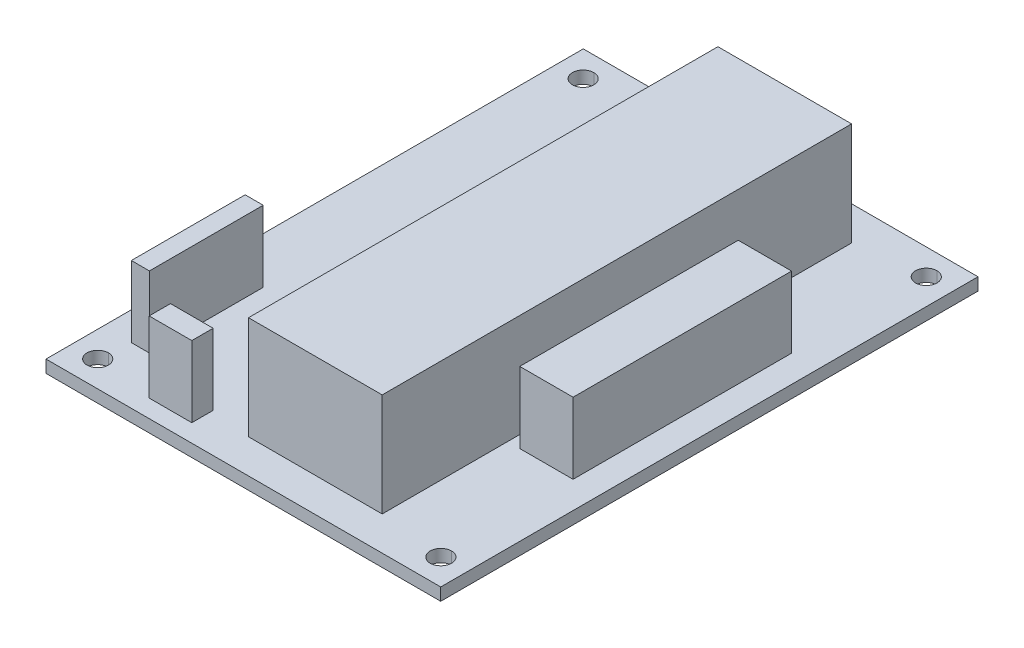
ISO-10303-21;
HEADER;
FILE_DESCRIPTION(('STEP AP214'),'2;1');
FILE_NAME('part.step','',(''),(''),'','','');
FILE_SCHEMA(('AUTOMOTIVE_DESIGN { 1 0 10303 214 1 1 1 1 }'));
ENDSEC;
DATA;
#1=APPLICATION_CONTEXT('core data for automotive mechanical design processes');
#2=APPLICATION_PROTOCOL_DEFINITION('international standard','automotive_design',2000,#1);
#3=PRODUCT_CONTEXT('',#1,'mechanical');
#4=PRODUCT('Part','Part','',(#3));
#5=PRODUCT_RELATED_PRODUCT_CATEGORY('part','',(#4));
#6=PRODUCT_DEFINITION_FORMATION('','',#4);
#7=PRODUCT_DEFINITION_CONTEXT('part definition',#1,'design');
#8=PRODUCT_DEFINITION('design','',#6,#7);
#9=PRODUCT_DEFINITION_SHAPE('','',#8);
#10=(LENGTH_UNIT() NAMED_UNIT(*) SI_UNIT(.MILLI.,.METRE.));
#11=(NAMED_UNIT(*) PLANE_ANGLE_UNIT() SI_UNIT($,.RADIAN.));
#12=(NAMED_UNIT(*) SI_UNIT($,.STERADIAN.) SOLID_ANGLE_UNIT());
#13=UNCERTAINTY_MEASURE_WITH_UNIT(LENGTH_MEASURE(1.E-05),#10,'distance_accuracy_value','');
#14=(GEOMETRIC_REPRESENTATION_CONTEXT(3) GLOBAL_UNCERTAINTY_ASSIGNED_CONTEXT((#13)) GLOBAL_UNIT_ASSIGNED_CONTEXT((#10,
#11,#12)) REPRESENTATION_CONTEXT('',''));
#15=CARTESIAN_POINT('',(0.,0.,0.));
#16=DIRECTION('',(0.,0.,1.));
#17=DIRECTION('',(1.,0.,0.));
#18=AXIS2_PLACEMENT_3D('',#15,#16,#17);
#19=CARTESIAN_POINT('',(0.,11.75,0.));
#20=DIRECTION('',(0.,1.,0.));
#21=DIRECTION('',(1.,0.,0.));
#22=AXIS2_PLACEMENT_3D('',#19,#20,#21);
#23=PLANE('',#22);
#24=DIRECTION('',(0.,0.,-1.));
#25=VECTOR('',#24,1.);
#26=CARTESIAN_POINT('',(-9.75,11.75,32.27));
#27=LINE('',#26,#25);
#28=CARTESIAN_POINT('',(-9.75,11.75,35.27));
#29=VERTEX_POINT('',#28);
#30=CARTESIAN_POINT('',(-9.75,11.75,32.27));
#31=VERTEX_POINT('',#30);
#32=EDGE_CURVE('E393',#29,#31,#27,.T.);
#33=ORIENTED_EDGE('',*,*,#32,.T.);
#34=DIRECTION('',(-1.,0.,0.));
#35=VECTOR('',#34,1.);
#36=CARTESIAN_POINT('',(-15.75,11.75,32.27));
#37=LINE('',#36,#35);
#38=CARTESIAN_POINT('',(-15.75,11.75,32.27));
#39=VERTEX_POINT('',#38);
#40=EDGE_CURVE('E315',#31,#39,#37,.T.);
#41=ORIENTED_EDGE('',*,*,#40,.T.);
#42=DIRECTION('',(0.,0.,1.));
#43=VECTOR('',#42,1.);
#44=CARTESIAN_POINT('',(-15.75,11.75,32.27));
#45=LINE('',#44,#43);
#46=CARTESIAN_POINT('',(-15.75,11.75,35.27));
#47=VERTEX_POINT('',#46);
#48=EDGE_CURVE('E28',#39,#47,#45,.T.);
#49=ORIENTED_EDGE('',*,*,#48,.T.);
#50=DIRECTION('',(1.,0.,0.));
#51=VECTOR('',#50,1.);
#52=CARTESIAN_POINT('',(-15.75,11.75,35.27));
#53=LINE('',#52,#51);
#54=EDGE_CURVE('E11',#47,#29,#53,.T.);
#55=ORIENTED_EDGE('',*,*,#54,.T.);
#56=EDGE_LOOP('',(#33,#41,#49,#55));
#57=FACE_BOUND('',#56,.T.);
#58=ADVANCED_FACE('F17',(#57),#23,.T.);
#59=CARTESIAN_POINT('',(-15.75,11.75,35.27));
#60=DIRECTION('',(0.,0.,-1.));
#61=DIRECTION('',(0.,-1.,0.));
#62=AXIS2_PLACEMENT_3D('',#59,#60,#61);
#63=PLANE('',#62);
#64=DIRECTION('',(1.,0.,0.));
#65=VECTOR('',#64,1.);
#66=CARTESIAN_POINT('',(-15.75,1.75,35.27));
#67=LINE('',#66,#65);
#68=CARTESIAN_POINT('',(-15.75,1.75,35.27));
#69=VERTEX_POINT('',#68);
#70=CARTESIAN_POINT('',(-9.75,1.75,35.27));
#71=VERTEX_POINT('',#70);
#72=EDGE_CURVE('E373',#69,#71,#67,.T.);
#73=ORIENTED_EDGE('',*,*,#72,.T.);
#74=DIRECTION('',(0.,-1.,0.));
#75=VECTOR('',#74,1.);
#76=CARTESIAN_POINT('',(-9.75,11.75,35.27));
#77=LINE('',#76,#75);
#78=EDGE_CURVE('E389',#29,#71,#77,.T.);
#79=ORIENTED_EDGE('',*,*,#78,.F.);
#80=ORIENTED_EDGE('',*,*,#54,.F.);
#81=DIRECTION('',(0.,-1.,0.));
#82=VECTOR('',#81,1.);
#83=CARTESIAN_POINT('',(-15.75,11.75,35.27));
#84=LINE('',#83,#82);
#85=EDGE_CURVE('E313',#47,#69,#84,.T.);
#86=ORIENTED_EDGE('',*,*,#85,.T.);
#87=EDGE_LOOP('',(#73,#79,#80,#86));
#88=FACE_BOUND('',#87,.T.);
#89=ADVANCED_FACE('F671',(#88),#63,.F.);
#90=CARTESIAN_POINT('',(-15.75,11.75,32.27));
#91=DIRECTION('',(1.,0.,0.));
#92=DIRECTION('',(0.,1.,0.));
#93=AXIS2_PLACEMENT_3D('',#90,#91,#92);
#94=PLANE('',#93);
#95=DIRECTION('',(0.,0.,1.));
#96=VECTOR('',#95,1.);
#97=CARTESIAN_POINT('',(-15.75,1.75,32.27));
#98=LINE('',#97,#96);
#99=CARTESIAN_POINT('',(-15.75,1.75,32.27));
#100=VERTEX_POINT('',#99);
#101=EDGE_CURVE('E370',#100,#69,#98,.T.);
#102=ORIENTED_EDGE('',*,*,#101,.T.);
#103=ORIENTED_EDGE('',*,*,#85,.F.);
#104=ORIENTED_EDGE('',*,*,#48,.F.);
#105=DIRECTION('',(0.,-1.,0.));
#106=VECTOR('',#105,1.);
#107=CARTESIAN_POINT('',(-15.75,11.75,32.27));
#108=LINE('',#107,#106);
#109=EDGE_CURVE('E392',#39,#100,#108,.T.);
#110=ORIENTED_EDGE('',*,*,#109,.T.);
#111=EDGE_LOOP('',(#102,#103,#104,#110));
#112=FACE_BOUND('',#111,.T.);
#113=ADVANCED_FACE('F677',(#112),#94,.F.);
#114=CARTESIAN_POINT('',(-15.75,11.75,32.27));
#115=DIRECTION('',(0.,0.,1.));
#116=DIRECTION('',(1.,0.,0.));
#117=AXIS2_PLACEMENT_3D('',#114,#115,#116);
#118=PLANE('',#117);
#119=DIRECTION('',(-1.,0.,0.));
#120=VECTOR('',#119,1.);
#121=CARTESIAN_POINT('',(-15.75,1.75,32.27));
#122=LINE('',#121,#120);
#123=CARTESIAN_POINT('',(-9.75,1.75,32.27));
#124=VERTEX_POINT('',#123);
#125=EDGE_CURVE('E359',#124,#100,#122,.T.);
#126=ORIENTED_EDGE('',*,*,#125,.T.);
#127=ORIENTED_EDGE('',*,*,#109,.F.);
#128=ORIENTED_EDGE('',*,*,#40,.F.);
#129=DIRECTION('',(0.,-1.,0.));
#130=VECTOR('',#129,1.);
#131=CARTESIAN_POINT('',(-9.75,11.75,32.27));
#132=LINE('',#131,#130);
#133=EDGE_CURVE('E503',#31,#124,#132,.T.);
#134=ORIENTED_EDGE('',*,*,#133,.T.);
#135=EDGE_LOOP('',(#126,#127,#128,#134));
#136=FACE_BOUND('',#135,.T.);
#137=ADVANCED_FACE('F711',(#136),#118,.F.);
#138=CARTESIAN_POINT('',(-9.75,11.75,32.27));
#139=DIRECTION('',(-1.,0.,0.));
#140=DIRECTION('',(0.,0.,1.));
#141=AXIS2_PLACEMENT_3D('',#138,#139,#140);
#142=PLANE('',#141);
#143=DIRECTION('',(0.,0.,-1.));
#144=VECTOR('',#143,1.);
#145=CARTESIAN_POINT('',(-9.75,1.75,32.27));
#146=LINE('',#145,#144);
#147=EDGE_CURVE('E511',#71,#124,#146,.T.);
#148=ORIENTED_EDGE('',*,*,#147,.T.);
#149=ORIENTED_EDGE('',*,*,#133,.F.);
#150=ORIENTED_EDGE('',*,*,#32,.F.);
#151=ORIENTED_EDGE('',*,*,#78,.T.);
#152=EDGE_LOOP('',(#148,#149,#150,#151));
#153=FACE_BOUND('',#152,.T.);
#154=ADVANCED_FACE('F707',(#153),#142,.F.);
#155=CARTESIAN_POINT('',(0.,11.75,0.));
#156=DIRECTION('',(0.,1.,0.));
#157=DIRECTION('',(1.,0.,0.));
#158=AXIS2_PLACEMENT_3D('',#155,#156,#157);
#159=PLANE('',#158);
#160=DIRECTION('',(0.,0.,-1.));
#161=VECTOR('',#160,1.);
#162=CARTESIAN_POINT('',(-21.21,11.75,13.77));
#163=LINE('',#162,#161);
#164=CARTESIAN_POINT('',(-21.21,11.75,29.77));
#165=VERTEX_POINT('',#164);
#166=CARTESIAN_POINT('',(-21.21,11.75,13.77));
#167=VERTEX_POINT('',#166);
#168=EDGE_CURVE('E443',#165,#167,#163,.T.);
#169=ORIENTED_EDGE('',*,*,#168,.T.);
#170=DIRECTION('',(-1.,0.,0.));
#171=VECTOR('',#170,1.);
#172=CARTESIAN_POINT('',(-23.75,11.75,13.77));
#173=LINE('',#172,#171);
#174=CARTESIAN_POINT('',(-23.75,11.75,13.77));
#175=VERTEX_POINT('',#174);
#176=EDGE_CURVE('E422',#167,#175,#173,.T.);
#177=ORIENTED_EDGE('',*,*,#176,.T.);
#178=DIRECTION('',(0.,0.,1.));
#179=VECTOR('',#178,1.);
#180=CARTESIAN_POINT('',(-23.75,11.75,13.77));
#181=LINE('',#180,#179);
#182=CARTESIAN_POINT('',(-23.75,11.75,29.77));
#183=VERTEX_POINT('',#182);
#184=EDGE_CURVE('E360',#175,#183,#181,.T.);
#185=ORIENTED_EDGE('',*,*,#184,.T.);
#186=DIRECTION('',(1.,0.,0.));
#187=VECTOR('',#186,1.);
#188=CARTESIAN_POINT('',(-23.75,11.75,29.77));
#189=LINE('',#188,#187);
#190=EDGE_CURVE('E364',#183,#165,#189,.T.);
#191=ORIENTED_EDGE('',*,*,#190,.T.);
#192=EDGE_LOOP('',(#169,#177,#185,#191));
#193=FACE_BOUND('',#192,.T.);
#194=ADVANCED_FACE('F710',(#193),#159,.T.);
#195=CARTESIAN_POINT('',(-23.75,11.75,29.77));
#196=DIRECTION('',(0.,0.,-1.));
#197=DIRECTION('',(0.,-1.,0.));
#198=AXIS2_PLACEMENT_3D('',#195,#196,#197);
#199=PLANE('',#198);
#200=DIRECTION('',(1.,0.,0.));
#201=VECTOR('',#200,1.);
#202=CARTESIAN_POINT('',(-23.75,1.75,29.77));
#203=LINE('',#202,#201);
#204=CARTESIAN_POINT('',(-23.75,1.75,29.77));
#205=VERTEX_POINT('',#204);
#206=CARTESIAN_POINT('',(-21.21,1.75,29.77));
#207=VERTEX_POINT('',#206);
#208=EDGE_CURVE('E426',#205,#207,#203,.T.);
#209=ORIENTED_EDGE('',*,*,#208,.T.);
#210=DIRECTION('',(0.,-1.,0.));
#211=VECTOR('',#210,1.);
#212=CARTESIAN_POINT('',(-21.21,11.75,29.77));
#213=LINE('',#212,#211);
#214=EDGE_CURVE('E21',#165,#207,#213,.T.);
#215=ORIENTED_EDGE('',*,*,#214,.F.);
#216=ORIENTED_EDGE('',*,*,#190,.F.);
#217=DIRECTION('',(0.,-1.,0.));
#218=VECTOR('',#217,1.);
#219=CARTESIAN_POINT('',(-23.75,11.75,29.77));
#220=LINE('',#219,#218);
#221=EDGE_CURVE('E365',#183,#205,#220,.T.);
#222=ORIENTED_EDGE('',*,*,#221,.T.);
#223=EDGE_LOOP('',(#209,#215,#216,#222));
#224=FACE_BOUND('',#223,.T.);
#225=ADVANCED_FACE('F705',(#224),#199,.F.);
#226=CARTESIAN_POINT('',(-23.75,11.75,13.77));
#227=DIRECTION('',(1.,0.,0.));
#228=DIRECTION('',(0.,0.,-1.));
#229=AXIS2_PLACEMENT_3D('',#226,#227,#228);
#230=PLANE('',#229);
#231=DIRECTION('',(0.,0.,1.));
#232=VECTOR('',#231,1.);
#233=CARTESIAN_POINT('',(-23.75,1.75,13.77));
#234=LINE('',#233,#232);
#235=CARTESIAN_POINT('',(-23.75,1.75,13.77));
#236=VERTEX_POINT('',#235);
#237=EDGE_CURVE('E353',#236,#205,#234,.T.);
#238=ORIENTED_EDGE('',*,*,#237,.T.);
#239=ORIENTED_EDGE('',*,*,#221,.F.);
#240=ORIENTED_EDGE('',*,*,#184,.F.);
#241=DIRECTION('',(0.,-1.,0.));
#242=VECTOR('',#241,1.);
#243=CARTESIAN_POINT('',(-23.75,11.75,13.77));
#244=LINE('',#243,#242);
#245=EDGE_CURVE('E419',#175,#236,#244,.T.);
#246=ORIENTED_EDGE('',*,*,#245,.T.);
#247=EDGE_LOOP('',(#238,#239,#240,#246));
#248=FACE_BOUND('',#247,.T.);
#249=ADVANCED_FACE('F702',(#248),#230,.F.);
#250=CARTESIAN_POINT('',(-23.75,11.75,13.77));
#251=DIRECTION('',(0.,0.,1.));
#252=DIRECTION('',(1.,0.,0.));
#253=AXIS2_PLACEMENT_3D('',#250,#251,#252);
#254=PLANE('',#253);
#255=DIRECTION('',(-1.,0.,0.));
#256=VECTOR('',#255,1.);
#257=CARTESIAN_POINT('',(-23.75,1.75,13.77));
#258=LINE('',#257,#256);
#259=CARTESIAN_POINT('',(-21.21,1.75,13.77));
#260=VERTEX_POINT('',#259);
#261=EDGE_CURVE('E319',#260,#236,#258,.T.);
#262=ORIENTED_EDGE('',*,*,#261,.T.);
#263=ORIENTED_EDGE('',*,*,#245,.F.);
#264=ORIENTED_EDGE('',*,*,#176,.F.);
#265=DIRECTION('',(0.,-1.,0.));
#266=VECTOR('',#265,1.);
#267=CARTESIAN_POINT('',(-21.21,11.75,13.77));
#268=LINE('',#267,#266);
#269=EDGE_CURVE('E441',#167,#260,#268,.T.);
#270=ORIENTED_EDGE('',*,*,#269,.T.);
#271=EDGE_LOOP('',(#262,#263,#264,#270));
#272=FACE_BOUND('',#271,.T.);
#273=ADVANCED_FACE('F679',(#272),#254,.F.);
#274=CARTESIAN_POINT('',(-21.21,11.75,13.77));
#275=DIRECTION('',(-1.,0.,0.));
#276=DIRECTION('',(0.,1.,0.));
#277=AXIS2_PLACEMENT_3D('',#274,#275,#276);
#278=PLANE('',#277);
#279=DIRECTION('',(0.,0.,-1.));
#280=VECTOR('',#279,1.);
#281=CARTESIAN_POINT('',(-21.21,1.75,13.77));
#282=LINE('',#281,#280);
#283=EDGE_CURVE('E369',#207,#260,#282,.T.);
#284=ORIENTED_EDGE('',*,*,#283,.T.);
#285=ORIENTED_EDGE('',*,*,#269,.F.);
#286=ORIENTED_EDGE('',*,*,#168,.F.);
#287=ORIENTED_EDGE('',*,*,#214,.T.);
#288=EDGE_LOOP('',(#284,#285,#286,#287));
#289=FACE_BOUND('',#288,.T.);
#290=ADVANCED_FACE('F697',(#289),#278,.F.);
#291=CARTESIAN_POINT('',(0.,11.75,0.));
#292=DIRECTION('',(0.,1.,0.));
#293=DIRECTION('',(1.,0.,0.));
#294=AXIS2_PLACEMENT_3D('',#291,#292,#293);
#295=PLANE('',#294);
#296=DIRECTION('',(0.,0.,-1.));
#297=VECTOR('',#296,1.);
#298=CARTESIAN_POINT('',(23.95,11.75,-15.36));
#299=LINE('',#298,#297);
#300=CARTESIAN_POINT('',(23.95,11.75,15.36));
#301=VERTEX_POINT('',#300);
#302=CARTESIAN_POINT('',(23.95,11.75,-15.36));
#303=VERTEX_POINT('',#302);
#304=EDGE_CURVE('E388',#301,#303,#299,.T.);
#305=ORIENTED_EDGE('',*,*,#304,.T.);
#306=DIRECTION('',(-1.,0.,0.));
#307=VECTOR('',#306,1.);
#308=CARTESIAN_POINT('',(16.45,11.75,-15.36));
#309=LINE('',#308,#307);
#310=CARTESIAN_POINT('',(16.45,11.75,-15.36));
#311=VERTEX_POINT('',#310);
#312=EDGE_CURVE('E236',#303,#311,#309,.T.);
#313=ORIENTED_EDGE('',*,*,#312,.T.);
#314=DIRECTION('',(0.,0.,1.));
#315=VECTOR('',#314,1.);
#316=CARTESIAN_POINT('',(16.45,11.75,-15.36));
#317=LINE('',#316,#315);
#318=CARTESIAN_POINT('',(16.45,11.75,15.36));
#319=VERTEX_POINT('',#318);
#320=EDGE_CURVE('E455',#311,#319,#317,.T.);
#321=ORIENTED_EDGE('',*,*,#320,.T.);
#322=DIRECTION('',(1.,0.,0.));
#323=VECTOR('',#322,1.);
#324=CARTESIAN_POINT('',(16.45,11.75,15.36));
#325=LINE('',#324,#323);
#326=EDGE_CURVE('E444',#319,#301,#325,.T.);
#327=ORIENTED_EDGE('',*,*,#326,.T.);
#328=EDGE_LOOP('',(#305,#313,#321,#327));
#329=FACE_BOUND('',#328,.T.);
#330=ADVANCED_FACE('F692',(#329),#295,.T.);
#331=CARTESIAN_POINT('',(16.45,11.75,15.36));
#332=DIRECTION('',(0.,0.,-1.));
#333=DIRECTION('',(0.,-1.,0.));
#334=AXIS2_PLACEMENT_3D('',#331,#332,#333);
#335=PLANE('',#334);
#336=DIRECTION('',(1.,0.,0.));
#337=VECTOR('',#336,1.);
#338=CARTESIAN_POINT('',(16.45,1.75,15.36));
#339=LINE('',#338,#337);
#340=CARTESIAN_POINT('',(16.45,1.75,15.36));
#341=VERTEX_POINT('',#340);
#342=CARTESIAN_POINT('',(23.95,1.75,15.36));
#343=VERTEX_POINT('',#342);
#344=EDGE_CURVE('E326',#341,#343,#339,.T.);
#345=ORIENTED_EDGE('',*,*,#344,.T.);
#346=DIRECTION('',(0.,-1.,0.));
#347=VECTOR('',#346,1.);
#348=CARTESIAN_POINT('',(23.95,11.75,15.36));
#349=LINE('',#348,#347);
#350=EDGE_CURVE('E262',#301,#343,#349,.T.);
#351=ORIENTED_EDGE('',*,*,#350,.F.);
#352=ORIENTED_EDGE('',*,*,#326,.F.);
#353=DIRECTION('',(0.,-1.,0.));
#354=VECTOR('',#353,1.);
#355=CARTESIAN_POINT('',(16.45,11.75,15.36));
#356=LINE('',#355,#354);
#357=EDGE_CURVE('E348',#319,#341,#356,.T.);
#358=ORIENTED_EDGE('',*,*,#357,.T.);
#359=EDGE_LOOP('',(#345,#351,#352,#358));
#360=FACE_BOUND('',#359,.T.);
#361=ADVANCED_FACE('F590',(#360),#335,.F.);
#362=CARTESIAN_POINT('',(16.45,11.75,-15.36));
#363=DIRECTION('',(1.,0.,0.));
#364=DIRECTION('',(0.,0.,-1.));
#365=AXIS2_PLACEMENT_3D('',#362,#363,#364);
#366=PLANE('',#365);
#367=DIRECTION('',(0.,0.,1.));
#368=VECTOR('',#367,1.);
#369=CARTESIAN_POINT('',(16.45,1.75,-15.36));
#370=LINE('',#369,#368);
#371=CARTESIAN_POINT('',(16.45,1.75,-15.36));
#372=VERTEX_POINT('',#371);
#373=EDGE_CURVE('E329',#372,#341,#370,.T.);
#374=ORIENTED_EDGE('',*,*,#373,.T.);
#375=ORIENTED_EDGE('',*,*,#357,.F.);
#376=ORIENTED_EDGE('',*,*,#320,.F.);
#377=DIRECTION('',(0.,-1.,0.));
#378=VECTOR('',#377,1.);
#379=CARTESIAN_POINT('',(16.45,11.75,-15.36));
#380=LINE('',#379,#378);
#381=EDGE_CURVE('E349',#311,#372,#380,.T.);
#382=ORIENTED_EDGE('',*,*,#381,.T.);
#383=EDGE_LOOP('',(#374,#375,#376,#382));
#384=FACE_BOUND('',#383,.T.);
#385=ADVANCED_FACE('F19',(#384),#366,.F.);
#386=CARTESIAN_POINT('',(16.45,11.75,-15.36));
#387=DIRECTION('',(0.,0.,1.));
#388=DIRECTION('',(1.,0.,0.));
#389=AXIS2_PLACEMENT_3D('',#386,#387,#388);
#390=PLANE('',#389);
#391=DIRECTION('',(-1.,0.,0.));
#392=VECTOR('',#391,1.);
#393=CARTESIAN_POINT('',(16.45,1.75,-15.36));
#394=LINE('',#393,#392);
#395=CARTESIAN_POINT('',(23.95,1.75,-15.36));
#396=VERTEX_POINT('',#395);
#397=EDGE_CURVE('E384',#396,#372,#394,.T.);
#398=ORIENTED_EDGE('',*,*,#397,.T.);
#399=ORIENTED_EDGE('',*,*,#381,.F.);
#400=ORIENTED_EDGE('',*,*,#312,.F.);
#401=DIRECTION('',(0.,-1.,0.));
#402=VECTOR('',#401,1.);
#403=CARTESIAN_POINT('',(23.95,11.75,-15.36));
#404=LINE('',#403,#402);
#405=EDGE_CURVE('E385',#303,#396,#404,.T.);
#406=ORIENTED_EDGE('',*,*,#405,.T.);
#407=EDGE_LOOP('',(#398,#399,#400,#406));
#408=FACE_BOUND('',#407,.T.);
#409=ADVANCED_FACE('F582',(#408),#390,.F.);
#410=CARTESIAN_POINT('',(23.95,11.75,-15.36));
#411=DIRECTION('',(-1.,0.,0.));
#412=DIRECTION('',(0.,1.,0.));
#413=AXIS2_PLACEMENT_3D('',#410,#411,#412);
#414=PLANE('',#413);
#415=DIRECTION('',(0.,0.,-1.));
#416=VECTOR('',#415,1.);
#417=CARTESIAN_POINT('',(23.95,1.75,-15.36));
#418=LINE('',#417,#416);
#419=EDGE_CURVE('E330',#343,#396,#418,.T.);
#420=ORIENTED_EDGE('',*,*,#419,.T.);
#421=ORIENTED_EDGE('',*,*,#405,.F.);
#422=ORIENTED_EDGE('',*,*,#304,.F.);
#423=ORIENTED_EDGE('',*,*,#350,.T.);
#424=EDGE_LOOP('',(#420,#421,#422,#423));
#425=FACE_BOUND('',#424,.T.);
#426=ADVANCED_FACE('F682',(#425),#414,.F.);
#427=CARTESIAN_POINT('',(0.,16.25,0.));
#428=DIRECTION('',(0.,-1.,0.));
#429=DIRECTION('',(0.,0.,-1.));
#430=AXIS2_PLACEMENT_3D('',#427,#428,#429);
#431=PLANE('',#430);
#432=DIRECTION('',(0.,0.,1.));
#433=VECTOR('',#432,1.);
#434=CARTESIAN_POINT('',(-4.05,16.25,-33.));
#435=LINE('',#434,#433);
#436=CARTESIAN_POINT('',(-4.05,16.25,-33.));
#437=VERTEX_POINT('',#436);
#438=CARTESIAN_POINT('',(-4.05,16.25,33.));
#439=VERTEX_POINT('',#438);
#440=EDGE_CURVE('E436',#437,#439,#435,.T.);
#441=ORIENTED_EDGE('',*,*,#440,.T.);
#442=DIRECTION('',(1.,0.,0.));
#443=VECTOR('',#442,1.);
#444=CARTESIAN_POINT('',(14.75,16.25,33.));
#445=LINE('',#444,#443);
#446=CARTESIAN_POINT('',(14.75,16.25,33.));
#447=VERTEX_POINT('',#446);
#448=EDGE_CURVE('E282',#439,#447,#445,.T.);
#449=ORIENTED_EDGE('',*,*,#448,.T.);
#450=DIRECTION('',(0.,0.,-1.));
#451=VECTOR('',#450,1.);
#452=CARTESIAN_POINT('',(14.75,16.25,-33.));
#453=LINE('',#452,#451);
#454=CARTESIAN_POINT('',(14.75,16.25,-33.));
#455=VERTEX_POINT('',#454);
#456=EDGE_CURVE('E278',#447,#455,#453,.T.);
#457=ORIENTED_EDGE('',*,*,#456,.T.);
#458=DIRECTION('',(-1.,0.,0.));
#459=VECTOR('',#458,1.);
#460=CARTESIAN_POINT('',(14.75,16.25,-33.));
#461=LINE('',#460,#459);
#462=EDGE_CURVE('E248',#455,#437,#461,.T.);
#463=ORIENTED_EDGE('',*,*,#462,.T.);
#464=EDGE_LOOP('',(#441,#449,#457,#463));
#465=FACE_BOUND('',#464,.T.);
#466=ADVANCED_FACE('F687',(#465),#431,.F.);
#467=CARTESIAN_POINT('',(14.75,16.25,-33.));
#468=DIRECTION('',(0.,0.,1.));
#469=DIRECTION('',(1.,0.,0.));
#470=AXIS2_PLACEMENT_3D('',#467,#468,#469);
#471=PLANE('',#470);
#472=DIRECTION('',(-1.,0.,0.));
#473=VECTOR('',#472,1.);
#474=CARTESIAN_POINT('',(14.75,1.75,-33.));
#475=LINE('',#474,#473);
#476=CARTESIAN_POINT('',(14.75,1.75,-33.));
#477=VERTEX_POINT('',#476);
#478=CARTESIAN_POINT('',(-4.05,1.75,-33.));
#479=VERTEX_POINT('',#478);
#480=EDGE_CURVE('E299',#477,#479,#475,.T.);
#481=ORIENTED_EDGE('',*,*,#480,.T.);
#482=DIRECTION('',(0.,-1.,0.));
#483=VECTOR('',#482,1.);
#484=CARTESIAN_POINT('',(-4.05,16.25,-33.));
#485=LINE('',#484,#483);
#486=EDGE_CURVE('E283',#437,#479,#485,.T.);
#487=ORIENTED_EDGE('',*,*,#486,.F.);
#488=ORIENTED_EDGE('',*,*,#462,.F.);
#489=DIRECTION('',(0.,-1.,0.));
#490=VECTOR('',#489,1.);
#491=CARTESIAN_POINT('',(14.75,16.25,-33.));
#492=LINE('',#491,#490);
#493=EDGE_CURVE('E560',#455,#477,#492,.T.);
#494=ORIENTED_EDGE('',*,*,#493,.T.);
#495=EDGE_LOOP('',(#481,#487,#488,#494));
#496=FACE_BOUND('',#495,.T.);
#497=ADVANCED_FACE('F723',(#496),#471,.F.);
#498=CARTESIAN_POINT('',(14.75,16.25,-33.));
#499=DIRECTION('',(-1.,0.,0.));
#500=DIRECTION('',(0.,1.,0.));
#501=AXIS2_PLACEMENT_3D('',#498,#499,#500);
#502=PLANE('',#501);
#503=DIRECTION('',(0.,0.,-1.));
#504=VECTOR('',#503,1.);
#505=CARTESIAN_POINT('',(14.75,1.75,-33.));
#506=LINE('',#505,#504);
#507=CARTESIAN_POINT('',(14.75,1.75,33.));
#508=VERTEX_POINT('',#507);
#509=EDGE_CURVE('E276',#508,#477,#506,.T.);
#510=ORIENTED_EDGE('',*,*,#509,.T.);
#511=ORIENTED_EDGE('',*,*,#493,.F.);
#512=ORIENTED_EDGE('',*,*,#456,.F.);
#513=DIRECTION('',(0.,-1.,0.));
#514=VECTOR('',#513,1.);
#515=CARTESIAN_POINT('',(14.75,16.25,33.));
#516=LINE('',#515,#514);
#517=EDGE_CURVE('E271',#447,#508,#516,.T.);
#518=ORIENTED_EDGE('',*,*,#517,.T.);
#519=EDGE_LOOP('',(#510,#511,#512,#518));
#520=FACE_BOUND('',#519,.T.);
#521=ADVANCED_FACE('F273',(#520),#502,.F.);
#522=CARTESIAN_POINT('',(14.75,16.25,33.));
#523=DIRECTION('',(0.,0.,-1.));
#524=DIRECTION('',(-1.,0.,0.));
#525=AXIS2_PLACEMENT_3D('',#522,#523,#524);
#526=PLANE('',#525);
#527=DIRECTION('',(1.,0.,0.));
#528=VECTOR('',#527,1.);
#529=CARTESIAN_POINT('',(14.75,1.75,33.));
#530=LINE('',#529,#528);
#531=CARTESIAN_POINT('',(-4.05,1.75,33.));
#532=VERTEX_POINT('',#531);
#533=EDGE_CURVE('E286',#532,#508,#530,.T.);
#534=ORIENTED_EDGE('',*,*,#533,.T.);
#535=ORIENTED_EDGE('',*,*,#517,.F.);
#536=ORIENTED_EDGE('',*,*,#448,.F.);
#537=DIRECTION('',(0.,-1.,0.));
#538=VECTOR('',#537,1.);
#539=CARTESIAN_POINT('',(-4.05,16.25,33.));
#540=LINE('',#539,#538);
#541=EDGE_CURVE('E289',#439,#532,#540,.T.);
#542=ORIENTED_EDGE('',*,*,#541,.T.);
#543=EDGE_LOOP('',(#534,#535,#536,#542));
#544=FACE_BOUND('',#543,.T.);
#545=ADVANCED_FACE('F287',(#544),#526,.F.);
#546=CARTESIAN_POINT('',(-4.05,16.25,-33.));
#547=DIRECTION('',(1.,0.,0.));
#548=DIRECTION('',(0.,0.,-1.));
#549=AXIS2_PLACEMENT_3D('',#546,#547,#548);
#550=PLANE('',#549);
#551=DIRECTION('',(0.,0.,1.));
#552=VECTOR('',#551,1.);
#553=CARTESIAN_POINT('',(-4.05,1.75,-33.));
#554=LINE('',#553,#552);
#555=EDGE_CURVE('E307',#479,#532,#554,.T.);
#556=ORIENTED_EDGE('',*,*,#555,.T.);
#557=ORIENTED_EDGE('',*,*,#541,.F.);
#558=ORIENTED_EDGE('',*,*,#440,.F.);
#559=ORIENTED_EDGE('',*,*,#486,.T.);
#560=EDGE_LOOP('',(#556,#557,#558,#559));
#561=FACE_BOUND('',#560,.T.);
#562=ADVANCED_FACE('F718',(#561),#550,.F.);
#563=CARTESIAN_POINT('',(24.125,1.75,-34.125));
#564=DIRECTION('',(0.,-1.,0.));
#565=DIRECTION('',(0.,0.,-1.));
#566=AXIS2_PLACEMENT_3D('',#563,#564,#565);
#567=CYLINDRICAL_SURFACE('',#566,1.5);
#568=DIRECTION('',(0.,-1.,0.));
#569=VECTOR('',#568,1.);
#570=CARTESIAN_POINT('',(24.125,1.75,-32.625));
#571=LINE('',#570,#569);
#572=CARTESIAN_POINT('',(24.125,1.75,-32.625));
#573=VERTEX_POINT('',#572);
#574=CARTESIAN_POINT('',(24.125,0.,-32.625));
#575=VERTEX_POINT('',#574);
#576=EDGE_CURVE('E408',#573,#575,#571,.T.);
#577=ORIENTED_EDGE('',*,*,#576,.F.);
#578=CARTESIAN_POINT('',(24.125,1.75,-34.125));
#579=DIRECTION('',(0.,1.,0.));
#580=DIRECTION('',(0.,0.,1.));
#581=AXIS2_PLACEMENT_3D('',#578,#579,#580);
#582=CIRCLE('',#581,1.5);
#583=CARTESIAN_POINT('',(24.125,1.75,-35.625));
#584=VERTEX_POINT('',#583);
#585=EDGE_CURVE('E416',#573,#584,#582,.T.);
#586=ORIENTED_EDGE('',*,*,#585,.T.);
#587=DIRECTION('',(0.,-1.,0.));
#588=VECTOR('',#587,1.);
#589=CARTESIAN_POINT('',(24.125,1.75,-35.625));
#590=LINE('',#589,#588);
#591=CARTESIAN_POINT('',(24.125,0.,-35.625));
#592=VERTEX_POINT('',#591);
#593=EDGE_CURVE('E435',#584,#592,#590,.T.);
#594=ORIENTED_EDGE('',*,*,#593,.T.);
#595=CARTESIAN_POINT('',(24.125,0.,-34.125));
#596=DIRECTION('',(0.,1.,0.));
#597=DIRECTION('',(0.,0.,1.));
#598=AXIS2_PLACEMENT_3D('',#595,#596,#597);
#599=CIRCLE('',#598,1.5);
#600=EDGE_CURVE('E142',#575,#592,#599,.T.);
#601=ORIENTED_EDGE('',*,*,#600,.F.);
#602=EDGE_LOOP('',(#577,#586,#594,#601));
#603=FACE_BOUND('',#602,.T.);
#604=ADVANCED_FACE('F721',(#603),#567,.F.);
#605=CARTESIAN_POINT('',(24.125,1.75,34.125));
#606=DIRECTION('',(0.,-1.,0.));
#607=DIRECTION('',(0.,0.,-1.));
#608=AXIS2_PLACEMENT_3D('',#605,#606,#607);
#609=CYLINDRICAL_SURFACE('',#608,1.5);
#610=DIRECTION('',(0.,-1.,0.));
#611=VECTOR('',#610,1.);
#612=CARTESIAN_POINT('',(24.125,1.75,35.625));
#613=LINE('',#612,#611);
#614=CARTESIAN_POINT('',(24.125,1.75,35.625));
#615=VERTEX_POINT('',#614);
#616=CARTESIAN_POINT('',(24.125,0.,35.625));
#617=VERTEX_POINT('',#616);
#618=EDGE_CURVE('E434',#615,#617,#613,.T.);
#619=ORIENTED_EDGE('',*,*,#618,.F.);
#620=CARTESIAN_POINT('',(24.125,1.75,34.125));
#621=DIRECTION('',(0.,1.,0.));
#622=DIRECTION('',(0.,0.,1.));
#623=AXIS2_PLACEMENT_3D('',#620,#621,#622);
#624=CIRCLE('',#623,1.5);
#625=CARTESIAN_POINT('',(24.125,1.75,32.625));
#626=VERTEX_POINT('',#625);
#627=EDGE_CURVE('E398',#615,#626,#624,.T.);
#628=ORIENTED_EDGE('',*,*,#627,.T.);
#629=DIRECTION('',(0.,-1.,0.));
#630=VECTOR('',#629,1.);
#631=CARTESIAN_POINT('',(24.125,1.75,32.625));
#632=LINE('',#631,#630);
#633=CARTESIAN_POINT('',(24.125,0.,32.625));
#634=VERTEX_POINT('',#633);
#635=EDGE_CURVE('E403',#626,#634,#632,.T.);
#636=ORIENTED_EDGE('',*,*,#635,.T.);
#637=CARTESIAN_POINT('',(24.125,0.,34.125));
#638=DIRECTION('',(0.,1.,0.));
#639=DIRECTION('',(0.,0.,1.));
#640=AXIS2_PLACEMENT_3D('',#637,#638,#639);
#641=CIRCLE('',#640,1.5);
#642=EDGE_CURVE('E344',#617,#634,#641,.T.);
#643=ORIENTED_EDGE('',*,*,#642,.F.);
#644=EDGE_LOOP('',(#619,#628,#636,#643));
#645=FACE_BOUND('',#644,.T.);
#646=ADVANCED_FACE('F773',(#645),#609,.F.);
#647=CARTESIAN_POINT('',(-24.125,1.75,34.125));
#648=DIRECTION('',(0.,-1.,0.));
#649=DIRECTION('',(0.,0.,-1.));
#650=AXIS2_PLACEMENT_3D('',#647,#648,#649);
#651=CYLINDRICAL_SURFACE('',#650,1.5);
#652=DIRECTION('',(0.,-1.,0.));
#653=VECTOR('',#652,1.);
#654=CARTESIAN_POINT('',(-24.125,1.75,35.625));
#655=LINE('',#654,#653);
#656=CARTESIAN_POINT('',(-24.125,1.75,35.625));
#657=VERTEX_POINT('',#656);
#658=CARTESIAN_POINT('',(-24.125,0.,35.625));
#659=VERTEX_POINT('',#658);
#660=EDGE_CURVE('E380',#657,#659,#655,.T.);
#661=ORIENTED_EDGE('',*,*,#660,.F.);
#662=CARTESIAN_POINT('',(-24.125,1.75,34.125));
#663=DIRECTION('',(0.,1.,0.));
#664=DIRECTION('',(0.,0.,1.));
#665=AXIS2_PLACEMENT_3D('',#662,#663,#664);
#666=CIRCLE('',#665,1.5);
#667=CARTESIAN_POINT('',(-24.125,1.75,32.625));
#668=VERTEX_POINT('',#667);
#669=EDGE_CURVE('E394',#657,#668,#666,.T.);
#670=ORIENTED_EDGE('',*,*,#669,.T.);
#671=DIRECTION('',(0.,-1.,0.));
#672=VECTOR('',#671,1.);
#673=CARTESIAN_POINT('',(-24.125,1.75,32.625));
#674=LINE('',#673,#672);
#675=CARTESIAN_POINT('',(-24.125,0.,32.625));
#676=VERTEX_POINT('',#675);
#677=EDGE_CURVE('E379',#668,#676,#674,.T.);
#678=ORIENTED_EDGE('',*,*,#677,.T.);
#679=CARTESIAN_POINT('',(-24.125,0.,34.125));
#680=DIRECTION('',(0.,1.,0.));
#681=DIRECTION('',(0.,0.,1.));
#682=AXIS2_PLACEMENT_3D('',#679,#680,#681);
#683=CIRCLE('',#682,1.5);
#684=EDGE_CURVE('E336',#659,#676,#683,.T.);
#685=ORIENTED_EDGE('',*,*,#684,.F.);
#686=EDGE_LOOP('',(#661,#670,#678,#685));
#687=FACE_BOUND('',#686,.T.);
#688=ADVANCED_FACE('F612',(#687),#651,.F.);
#689=CARTESIAN_POINT('',(-24.125,1.75,-34.125));
#690=DIRECTION('',(0.,-1.,0.));
#691=DIRECTION('',(0.,0.,-1.));
#692=AXIS2_PLACEMENT_3D('',#689,#690,#691);
#693=CYLINDRICAL_SURFACE('',#692,1.5);
#694=DIRECTION('',(0.,-1.,0.));
#695=VECTOR('',#694,1.);
#696=CARTESIAN_POINT('',(-24.125,1.75,-32.625));
#697=LINE('',#696,#695);
#698=CARTESIAN_POINT('',(-24.125,1.75,-32.625));
#699=VERTEX_POINT('',#698);
#700=CARTESIAN_POINT('',(-24.125,0.,-32.625));
#701=VERTEX_POINT('',#700);
#702=EDGE_CURVE('E497',#699,#701,#697,.T.);
#703=ORIENTED_EDGE('',*,*,#702,.F.);
#704=CARTESIAN_POINT('',(-24.125,1.75,-34.125));
#705=DIRECTION('',(0.,1.,0.));
#706=DIRECTION('',(0.,0.,1.));
#707=AXIS2_PLACEMENT_3D('',#704,#705,#706);
#708=CIRCLE('',#707,1.5);
#709=CARTESIAN_POINT('',(-24.125,1.75,-35.625));
#710=VERTEX_POINT('',#709);
#711=EDGE_CURVE('E294',#699,#710,#708,.T.);
#712=ORIENTED_EDGE('',*,*,#711,.T.);
#713=DIRECTION('',(0.,-1.,0.));
#714=VECTOR('',#713,1.);
#715=CARTESIAN_POINT('',(-24.125,1.75,-35.625));
#716=LINE('',#715,#714);
#717=CARTESIAN_POINT('',(-24.125,0.,-35.625));
#718=VERTEX_POINT('',#717);
#719=EDGE_CURVE('E325',#710,#718,#716,.T.);
#720=ORIENTED_EDGE('',*,*,#719,.T.);
#721=CARTESIAN_POINT('',(-24.125,0.,-34.125));
#722=DIRECTION('',(0.,1.,0.));
#723=DIRECTION('',(0.,0.,1.));
#724=AXIS2_PLACEMENT_3D('',#721,#722,#723);
#725=CIRCLE('',#724,1.5);
#726=EDGE_CURVE('E339',#701,#718,#725,.T.);
#727=ORIENTED_EDGE('',*,*,#726,.F.);
#728=EDGE_LOOP('',(#703,#712,#720,#727));
#729=FACE_BOUND('',#728,.T.);
#730=ADVANCED_FACE('F715',(#729),#693,.F.);
#731=CARTESIAN_POINT('',(27.75,1.75,-37.77));
#732=DIRECTION('',(0.,0.,1.));
#733=DIRECTION('',(1.,0.,0.));
#734=AXIS2_PLACEMENT_3D('',#731,#732,#733);
#735=PLANE('',#734);
#736=DIRECTION('',(-1.,0.,0.));
#737=VECTOR('',#736,1.);
#738=CARTESIAN_POINT('',(27.75,0.,-37.77));
#739=LINE('',#738,#737);
#740=CARTESIAN_POINT('',(27.75,0.,-37.77));
#741=VERTEX_POINT('',#740);
#742=CARTESIAN_POINT('',(-27.75,0.,-37.77));
#743=VERTEX_POINT('',#742);
#744=EDGE_CURVE('E358',#741,#743,#739,.T.);
#745=ORIENTED_EDGE('',*,*,#744,.T.);
#746=DIRECTION('',(0.,-1.,0.));
#747=VECTOR('',#746,1.);
#748=CARTESIAN_POINT('',(-27.75,1.75,-37.77));
#749=LINE('',#748,#747);
#750=CARTESIAN_POINT('',(-27.75,1.75,-37.77));
#751=VERTEX_POINT('',#750);
#752=EDGE_CURVE('E471',#751,#743,#749,.T.);
#753=ORIENTED_EDGE('',*,*,#752,.F.);
#754=DIRECTION('',(-1.,0.,0.));
#755=VECTOR('',#754,1.);
#756=CARTESIAN_POINT('',(27.75,1.75,-37.77));
#757=LINE('',#756,#755);
#758=CARTESIAN_POINT('',(27.75,1.75,-37.77));
#759=VERTEX_POINT('',#758);
#760=EDGE_CURVE('E335',#759,#751,#757,.T.);
#761=ORIENTED_EDGE('',*,*,#760,.F.);
#762=DIRECTION('',(0.,-1.,0.));
#763=VECTOR('',#762,1.);
#764=CARTESIAN_POINT('',(27.75,1.75,-37.77));
#765=LINE('',#764,#763);
#766=EDGE_CURVE('E470',#759,#741,#765,.T.);
#767=ORIENTED_EDGE('',*,*,#766,.T.);
#768=EDGE_LOOP('',(#745,#753,#761,#767));
#769=FACE_BOUND('',#768,.T.);
#770=ADVANCED_FACE('F647',(#769),#735,.F.);
#771=CARTESIAN_POINT('',(27.75,1.75,-37.77));
#772=DIRECTION('',(-1.,0.,0.));
#773=DIRECTION('',(0.,1.,0.));
#774=AXIS2_PLACEMENT_3D('',#771,#772,#773);
#775=PLANE('',#774);
#776=DIRECTION('',(0.,0.,-1.));
#777=VECTOR('',#776,1.);
#778=CARTESIAN_POINT('',(27.75,0.,-37.77));
#779=LINE('',#778,#777);
#780=CARTESIAN_POINT('',(27.75,0.,37.77));
#781=VERTEX_POINT('',#780);
#782=EDGE_CURVE('E345',#781,#741,#779,.T.);
#783=ORIENTED_EDGE('',*,*,#782,.T.);
#784=ORIENTED_EDGE('',*,*,#766,.F.);
#785=DIRECTION('',(0.,0.,-1.));
#786=VECTOR('',#785,1.);
#787=CARTESIAN_POINT('',(27.75,1.75,-37.77));
#788=LINE('',#787,#786);
#789=CARTESIAN_POINT('',(27.75,1.75,37.77));
#790=VERTEX_POINT('',#789);
#791=EDGE_CURVE('E331',#790,#759,#788,.T.);
#792=ORIENTED_EDGE('',*,*,#791,.F.);
#793=DIRECTION('',(0.,-1.,0.));
#794=VECTOR('',#793,1.);
#795=CARTESIAN_POINT('',(27.75,1.75,37.77));
#796=LINE('',#795,#794);
#797=EDGE_CURVE('E469',#790,#781,#796,.T.);
#798=ORIENTED_EDGE('',*,*,#797,.T.);
#799=EDGE_LOOP('',(#783,#784,#792,#798));
#800=FACE_BOUND('',#799,.T.);
#801=ADVANCED_FACE('F657',(#800),#775,.F.);
#802=CARTESIAN_POINT('',(27.75,1.75,37.77));
#803=DIRECTION('',(0.,0.,-1.));
#804=DIRECTION('',(-1.,0.,0.));
#805=AXIS2_PLACEMENT_3D('',#802,#803,#804);
#806=PLANE('',#805);
#807=DIRECTION('',(1.,0.,0.));
#808=VECTOR('',#807,1.);
#809=CARTESIAN_POINT('',(27.75,0.,37.77));
#810=LINE('',#809,#808);
#811=CARTESIAN_POINT('',(-27.75,0.,37.77));
#812=VERTEX_POINT('',#811);
#813=EDGE_CURVE('E340',#812,#781,#810,.T.);
#814=ORIENTED_EDGE('',*,*,#813,.T.);
#815=ORIENTED_EDGE('',*,*,#797,.F.);
#816=DIRECTION('',(1.,0.,0.));
#817=VECTOR('',#816,1.);
#818=CARTESIAN_POINT('',(27.75,1.75,37.77));
#819=LINE('',#818,#817);
#820=CARTESIAN_POINT('',(-27.75,1.75,37.77));
#821=VERTEX_POINT('',#820);
#822=EDGE_CURVE('E324',#821,#790,#819,.T.);
#823=ORIENTED_EDGE('',*,*,#822,.F.);
#824=DIRECTION('',(0.,-1.,0.));
#825=VECTOR('',#824,1.);
#826=CARTESIAN_POINT('',(-27.75,1.75,37.77));
#827=LINE('',#826,#825);
#828=EDGE_CURVE('E506',#821,#812,#827,.T.);
#829=ORIENTED_EDGE('',*,*,#828,.T.);
#830=EDGE_LOOP('',(#814,#815,#823,#829));
#831=FACE_BOUND('',#830,.T.);
#832=ADVANCED_FACE('F658',(#831),#806,.F.);
#833=CARTESIAN_POINT('',(-27.75,1.75,-37.77));
#834=DIRECTION('',(1.,0.,0.));
#835=DIRECTION('',(0.,0.,-1.));
#836=AXIS2_PLACEMENT_3D('',#833,#834,#835);
#837=PLANE('',#836);
#838=DIRECTION('',(0.,0.,1.));
#839=VECTOR('',#838,1.);
#840=CARTESIAN_POINT('',(-27.75,0.,-37.77));
#841=LINE('',#840,#839);
#842=EDGE_CURVE('E354',#743,#812,#841,.T.);
#843=ORIENTED_EDGE('',*,*,#842,.T.);
#844=ORIENTED_EDGE('',*,*,#828,.F.);
#845=DIRECTION('',(0.,0.,1.));
#846=VECTOR('',#845,1.);
#847=CARTESIAN_POINT('',(-27.75,1.75,-37.77));
#848=LINE('',#847,#846);
#849=EDGE_CURVE('E320',#751,#821,#848,.T.);
#850=ORIENTED_EDGE('',*,*,#849,.F.);
#851=ORIENTED_EDGE('',*,*,#752,.T.);
#852=EDGE_LOOP('',(#843,#844,#850,#851));
#853=FACE_BOUND('',#852,.T.);
#854=ADVANCED_FACE('F652',(#853),#837,.F.);
#855=CARTESIAN_POINT('',(0.,0.,0.));
#856=DIRECTION('',(0.,-1.,0.));
#857=DIRECTION('',(0.,0.,-1.));
#858=AXIS2_PLACEMENT_3D('',#855,#856,#857);
#859=PLANE('',#858);
#860=CARTESIAN_POINT('',(24.125,0.,-34.125));
#861=DIRECTION('',(0.,1.,0.));
#862=DIRECTION('',(0.,0.,1.));
#863=AXIS2_PLACEMENT_3D('',#860,#861,#862);
#864=CIRCLE('',#863,1.5);
#865=EDGE_CURVE('E412',#592,#575,#864,.T.);
#866=ORIENTED_EDGE('',*,*,#865,.T.);
#867=ORIENTED_EDGE('',*,*,#600,.T.);
#868=EDGE_LOOP('',(#866,#867));
#869=FACE_BOUND('',#868,.T.);
#870=CARTESIAN_POINT('',(-24.125,0.,34.125));
#871=DIRECTION('',(0.,1.,0.));
#872=DIRECTION('',(0.,0.,1.));
#873=AXIS2_PLACEMENT_3D('',#870,#871,#872);
#874=CIRCLE('',#873,1.5);
#875=EDGE_CURVE('E375',#676,#659,#874,.T.);
#876=ORIENTED_EDGE('',*,*,#875,.T.);
#877=ORIENTED_EDGE('',*,*,#684,.T.);
#878=EDGE_LOOP('',(#876,#877));
#879=FACE_BOUND('',#878,.T.);
#880=CARTESIAN_POINT('',(-24.125,0.,-34.125));
#881=DIRECTION('',(0.,1.,0.));
#882=DIRECTION('',(0.,0.,1.));
#883=AXIS2_PLACEMENT_3D('',#880,#881,#882);
#884=CIRCLE('',#883,1.5);
#885=EDGE_CURVE('E493',#718,#701,#884,.T.);
#886=ORIENTED_EDGE('',*,*,#885,.T.);
#887=ORIENTED_EDGE('',*,*,#726,.T.);
#888=EDGE_LOOP('',(#886,#887));
#889=FACE_BOUND('',#888,.T.);
#890=CARTESIAN_POINT('',(24.125,0.,34.125));
#891=DIRECTION('',(0.,1.,0.));
#892=DIRECTION('',(0.,0.,1.));
#893=AXIS2_PLACEMENT_3D('',#890,#891,#892);
#894=CIRCLE('',#893,1.5);
#895=EDGE_CURVE('E407',#634,#617,#894,.T.);
#896=ORIENTED_EDGE('',*,*,#895,.T.);
#897=ORIENTED_EDGE('',*,*,#642,.T.);
#898=EDGE_LOOP('',(#896,#897));
#899=FACE_BOUND('',#898,.T.);
#900=ORIENTED_EDGE('',*,*,#842,.F.);
#901=ORIENTED_EDGE('',*,*,#744,.F.);
#902=ORIENTED_EDGE('',*,*,#782,.F.);
#903=ORIENTED_EDGE('',*,*,#813,.F.);
#904=EDGE_LOOP('',(#900,#901,#902,#903));
#905=FACE_BOUND('',#904,.T.);
#906=ADVANCED_FACE('F621',(#869,#879,#889,#899,#905),#859,.T.);
#907=CARTESIAN_POINT('',(0.,1.75,0.));
#908=DIRECTION('',(0.,-1.,0.));
#909=DIRECTION('',(0.,0.,-1.));
#910=AXIS2_PLACEMENT_3D('',#907,#908,#909);
#911=PLANE('',#910);
#912=ORIENTED_EDGE('',*,*,#147,.F.);
#913=ORIENTED_EDGE('',*,*,#72,.F.);
#914=ORIENTED_EDGE('',*,*,#101,.F.);
#915=ORIENTED_EDGE('',*,*,#125,.F.);
#916=EDGE_LOOP('',(#912,#913,#914,#915));
#917=FACE_BOUND('',#916,.T.);
#918=ORIENTED_EDGE('',*,*,#419,.F.);
#919=ORIENTED_EDGE('',*,*,#344,.F.);
#920=ORIENTED_EDGE('',*,*,#373,.F.);
#921=ORIENTED_EDGE('',*,*,#397,.F.);
#922=EDGE_LOOP('',(#918,#919,#920,#921));
#923=FACE_BOUND('',#922,.T.);
#924=CARTESIAN_POINT('',(24.125,1.75,-34.125));
#925=DIRECTION('',(0.,1.,0.));
#926=DIRECTION('',(0.,0.,1.));
#927=AXIS2_PLACEMENT_3D('',#924,#925,#926);
#928=CIRCLE('',#927,1.5);
#929=EDGE_CURVE('E413',#584,#573,#928,.T.);
#930=ORIENTED_EDGE('',*,*,#929,.F.);
#931=ORIENTED_EDGE('',*,*,#585,.F.);
#932=EDGE_LOOP('',(#930,#931));
#933=FACE_BOUND('',#932,.T.);
#934=CARTESIAN_POINT('',(24.125,1.75,34.125));
#935=DIRECTION('',(0.,1.,0.));
#936=DIRECTION('',(0.,0.,1.));
#937=AXIS2_PLACEMENT_3D('',#934,#935,#936);
#938=CIRCLE('',#937,1.5);
#939=EDGE_CURVE('E430',#626,#615,#938,.T.);
#940=ORIENTED_EDGE('',*,*,#939,.F.);
#941=ORIENTED_EDGE('',*,*,#627,.F.);
#942=EDGE_LOOP('',(#940,#941));
#943=FACE_BOUND('',#942,.T.);
#944=CARTESIAN_POINT('',(-24.125,1.75,34.125));
#945=DIRECTION('',(0.,1.,0.));
#946=DIRECTION('',(0.,0.,1.));
#947=AXIS2_PLACEMENT_3D('',#944,#945,#946);
#948=CIRCLE('',#947,1.5);
#949=EDGE_CURVE('E399',#668,#657,#948,.T.);
#950=ORIENTED_EDGE('',*,*,#949,.F.);
#951=ORIENTED_EDGE('',*,*,#669,.F.);
#952=EDGE_LOOP('',(#950,#951));
#953=FACE_BOUND('',#952,.T.);
#954=CARTESIAN_POINT('',(-24.125,1.75,-34.125));
#955=DIRECTION('',(0.,1.,0.));
#956=DIRECTION('',(0.,0.,1.));
#957=AXIS2_PLACEMENT_3D('',#954,#955,#956);
#958=CIRCLE('',#957,1.5);
#959=EDGE_CURVE('E489',#710,#699,#958,.T.);
#960=ORIENTED_EDGE('',*,*,#959,.F.);
#961=ORIENTED_EDGE('',*,*,#711,.F.);
#962=EDGE_LOOP('',(#960,#961));
#963=FACE_BOUND('',#962,.T.);
#964=ORIENTED_EDGE('',*,*,#555,.F.);
#965=ORIENTED_EDGE('',*,*,#480,.F.);
#966=ORIENTED_EDGE('',*,*,#509,.F.);
#967=ORIENTED_EDGE('',*,*,#533,.F.);
#968=EDGE_LOOP('',(#964,#965,#966,#967));
#969=FACE_BOUND('',#968,.T.);
#970=ORIENTED_EDGE('',*,*,#283,.F.);
#971=ORIENTED_EDGE('',*,*,#208,.F.);
#972=ORIENTED_EDGE('',*,*,#237,.F.);
#973=ORIENTED_EDGE('',*,*,#261,.F.);
#974=EDGE_LOOP('',(#970,#971,#972,#973));
#975=FACE_BOUND('',#974,.T.);
#976=ORIENTED_EDGE('',*,*,#849,.T.);
#977=ORIENTED_EDGE('',*,*,#822,.T.);
#978=ORIENTED_EDGE('',*,*,#791,.T.);
#979=ORIENTED_EDGE('',*,*,#760,.T.);
#980=EDGE_LOOP('',(#976,#977,#978,#979));
#981=FACE_BOUND('',#980,.T.);
#982=ADVANCED_FACE('F296',(#917,#923,#933,#943,#953,#963,#969,#975,#981),#911,.F.);
#983=CARTESIAN_POINT('',(-24.125,1.75,-34.125));
#984=DIRECTION('',(0.,-1.,0.));
#985=DIRECTION('',(0.,0.,-1.));
#986=AXIS2_PLACEMENT_3D('',#983,#984,#985);
#987=CYLINDRICAL_SURFACE('',#986,1.5);
#988=ORIENTED_EDGE('',*,*,#959,.T.);
#989=ORIENTED_EDGE('',*,*,#702,.T.);
#990=ORIENTED_EDGE('',*,*,#885,.F.);
#991=ORIENTED_EDGE('',*,*,#719,.F.);
#992=EDGE_LOOP('',(#988,#989,#990,#991));
#993=FACE_BOUND('',#992,.T.);
#994=ADVANCED_FACE('F620',(#993),#987,.F.);
#995=CARTESIAN_POINT('',(-24.125,1.75,34.125));
#996=DIRECTION('',(0.,-1.,0.));
#997=DIRECTION('',(0.,0.,-1.));
#998=AXIS2_PLACEMENT_3D('',#995,#996,#997);
#999=CYLINDRICAL_SURFACE('',#998,1.5);
#1000=ORIENTED_EDGE('',*,*,#949,.T.);
#1001=ORIENTED_EDGE('',*,*,#660,.T.);
#1002=ORIENTED_EDGE('',*,*,#875,.F.);
#1003=ORIENTED_EDGE('',*,*,#677,.F.);
#1004=EDGE_LOOP('',(#1000,#1001,#1002,#1003));
#1005=FACE_BOUND('',#1004,.T.);
#1006=ADVANCED_FACE('F617',(#1005),#999,.F.);
#1007=CARTESIAN_POINT('',(24.125,1.75,34.125));
#1008=DIRECTION('',(0.,-1.,0.));
#1009=DIRECTION('',(0.,0.,-1.));
#1010=AXIS2_PLACEMENT_3D('',#1007,#1008,#1009);
#1011=CYLINDRICAL_SURFACE('',#1010,1.5);
#1012=ORIENTED_EDGE('',*,*,#939,.T.);
#1013=ORIENTED_EDGE('',*,*,#618,.T.);
#1014=ORIENTED_EDGE('',*,*,#895,.F.);
#1015=ORIENTED_EDGE('',*,*,#635,.F.);
#1016=EDGE_LOOP('',(#1012,#1013,#1014,#1015));
#1017=FACE_BOUND('',#1016,.T.);
#1018=ADVANCED_FACE('F731',(#1017),#1011,.F.);
#1019=CARTESIAN_POINT('',(24.125,1.75,-34.125));
#1020=DIRECTION('',(0.,-1.,0.));
#1021=DIRECTION('',(0.,0.,-1.));
#1022=AXIS2_PLACEMENT_3D('',#1019,#1020,#1021);
#1023=CYLINDRICAL_SURFACE('',#1022,1.5);
#1024=ORIENTED_EDGE('',*,*,#929,.T.);
#1025=ORIENTED_EDGE('',*,*,#576,.T.);
#1026=ORIENTED_EDGE('',*,*,#865,.F.);
#1027=ORIENTED_EDGE('',*,*,#593,.F.);
#1028=EDGE_LOOP('',(#1024,#1025,#1026,#1027));
#1029=FACE_BOUND('',#1028,.T.);
#1030=ADVANCED_FACE('F729',(#1029),#1023,.F.);
#1031=CLOSED_SHELL('',(#58,#89,#113,#137,#154,#194,#225,#249,#273,#290,#330,#361,#385,#409,#426,
#466,#497,#521,#545,#562,#604,#646,#688,#730,#770,#801,#832,#854,#906,#982,#994,#1006,#1018,#1030));
#1032=MANIFOLD_SOLID_BREP('B1',#1031);
#1033=ADVANCED_BREP_SHAPE_REPRESENTATION('',(#18,#1032),#14);
#1034=SHAPE_DEFINITION_REPRESENTATION(#9,#1033);
ENDSEC;
END-ISO-10303-21;
